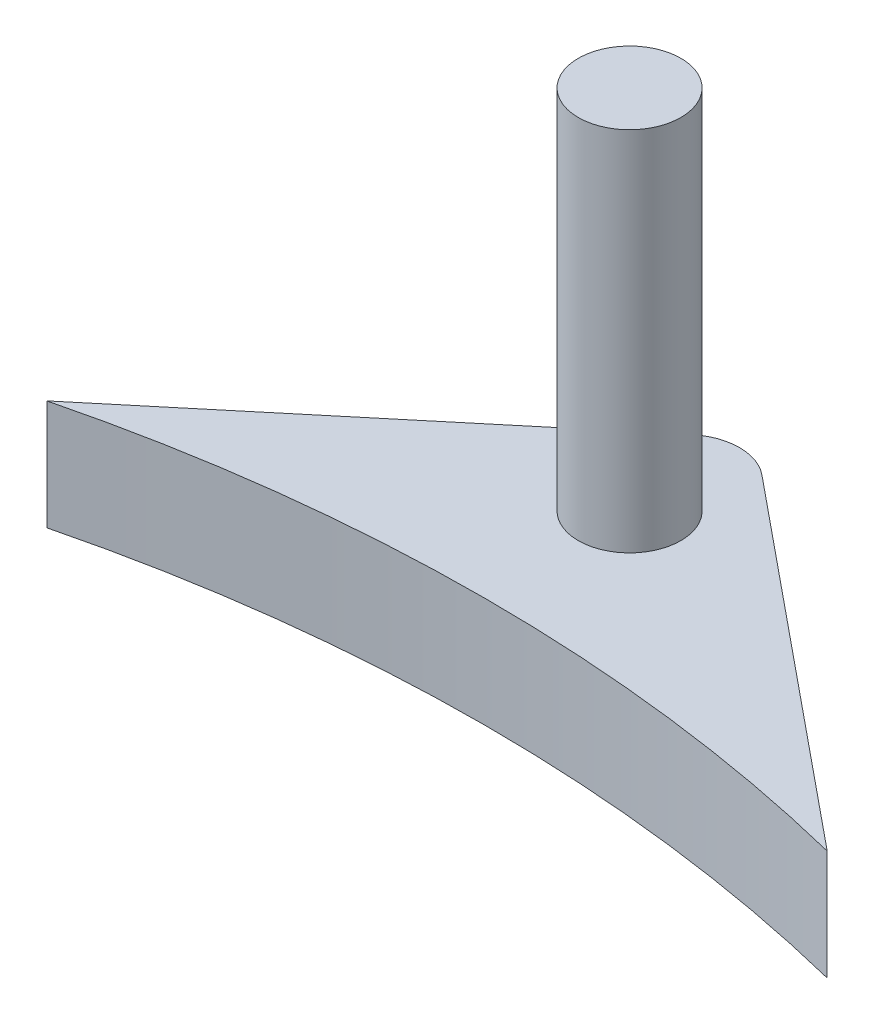
ISO-10303-21;
HEADER;
FILE_DESCRIPTION(('STEP AP214'),'2;1');
FILE_NAME('part.step','',(''),(''),'','','');
FILE_SCHEMA(('AUTOMOTIVE_DESIGN { 1 0 10303 214 1 1 1 1 }'));
ENDSEC;
DATA;
#1=APPLICATION_CONTEXT('core data for automotive mechanical design processes');
#2=APPLICATION_PROTOCOL_DEFINITION('international standard','automotive_design',2000,#1);
#3=PRODUCT_CONTEXT('',#1,'mechanical');
#4=PRODUCT('Part','Part','',(#3));
#5=PRODUCT_RELATED_PRODUCT_CATEGORY('part','',(#4));
#6=PRODUCT_DEFINITION_FORMATION('','',#4);
#7=PRODUCT_DEFINITION_CONTEXT('part definition',#1,'design');
#8=PRODUCT_DEFINITION('design','',#6,#7);
#9=PRODUCT_DEFINITION_SHAPE('','',#8);
#10=(LENGTH_UNIT() NAMED_UNIT(*) SI_UNIT(.MILLI.,.METRE.));
#11=(NAMED_UNIT(*) PLANE_ANGLE_UNIT() SI_UNIT($,.RADIAN.));
#12=(NAMED_UNIT(*) SI_UNIT($,.STERADIAN.) SOLID_ANGLE_UNIT());
#13=UNCERTAINTY_MEASURE_WITH_UNIT(LENGTH_MEASURE(1.E-05),#10,'distance_accuracy_value','');
#14=(GEOMETRIC_REPRESENTATION_CONTEXT(3) GLOBAL_UNCERTAINTY_ASSIGNED_CONTEXT((#13)) GLOBAL_UNIT_ASSIGNED_CONTEXT((#10,
#11,#12)) REPRESENTATION_CONTEXT('',''));
#15=CARTESIAN_POINT('',(0.,0.,0.));
#16=DIRECTION('',(0.,0.,1.));
#17=DIRECTION('',(1.,0.,0.));
#18=AXIS2_PLACEMENT_3D('',#15,#16,#17);
#19=CARTESIAN_POINT('',(0.,3.,0.));
#20=DIRECTION('',(0.,-1.,0.));
#21=DIRECTION('',(0.,0.,-1.));
#22=AXIS2_PLACEMENT_3D('',#19,#20,#21);
#23=CYLINDRICAL_SURFACE('',#22,1.5);
#24=CARTESIAN_POINT('',(0.,0.,0.));
#25=DIRECTION('',(0.,1.,0.));
#26=DIRECTION('',(0.,0.,1.));
#27=AXIS2_PLACEMENT_3D('',#24,#25,#26);
#28=CIRCLE('',#27,1.5);
#29=CARTESIAN_POINT('',(0.949630120317868,0.,-1.16112128332275));
#30=VERTEX_POINT('',#29);
#31=CARTESIAN_POINT('',(-0.960614143000478,0.,-1.15205054935426));
#32=VERTEX_POINT('',#31);
#33=EDGE_CURVE('E110',#30,#32,#28,.T.);
#34=ORIENTED_EDGE('',*,*,#33,.T.);
#35=DIRECTION('',(0.,-1.,0.));
#36=VECTOR('',#35,1.);
#37=CARTESIAN_POINT('',(-0.960614143000478,3.,-1.15205054935426));
#38=LINE('',#37,#36);
#39=CARTESIAN_POINT('',(-0.960614143000478,3.,-1.15205054935426));
#40=VERTEX_POINT('',#39);
#41=EDGE_CURVE('E42',#40,#32,#38,.T.);
#42=ORIENTED_EDGE('',*,*,#41,.F.);
#43=CARTESIAN_POINT('',(0.,3.,0.));
#44=DIRECTION('',(0.,1.,0.));
#45=DIRECTION('',(0.,0.,1.));
#46=AXIS2_PLACEMENT_3D('',#43,#44,#45);
#47=CIRCLE('',#46,1.5);
#48=CARTESIAN_POINT('',(0.949630120317868,3.,-1.16112128332275));
#49=VERTEX_POINT('',#48);
#50=EDGE_CURVE('E93',#49,#40,#47,.T.);
#51=ORIENTED_EDGE('',*,*,#50,.F.);
#52=DIRECTION('',(0.,-1.,0.));
#53=VECTOR('',#52,1.);
#54=CARTESIAN_POINT('',(0.949630120317868,3.,-1.16112128332275));
#55=LINE('',#54,#53);
#56=EDGE_CURVE('E106',#49,#30,#55,.T.);
#57=ORIENTED_EDGE('',*,*,#56,.T.);
#58=EDGE_LOOP('',(#34,#42,#51,#57));
#59=FACE_BOUND('',#58,.T.);
#60=ADVANCED_FACE('F39',(#59),#23,.T.);
#61=CARTESIAN_POINT('',(-0.960614143000478,3.,-1.15205054935426));
#62=DIRECTION('',(0.640409428666985,0.,0.768033699569508));
#63=DIRECTION('',(0.768033699569508,0.,-0.640409428666985));
#64=AXIS2_PLACEMENT_3D('',#61,#62,#63);
#65=PLANE('',#64);
#66=DIRECTION('',(-0.768033699569508,0.,0.640409428666985));
#67=VECTOR('',#66,1.);
#68=CARTESIAN_POINT('',(-0.960614143000478,0.,-1.15205054935426));
#69=LINE('',#68,#67);
#70=CARTESIAN_POINT('',(-10.5548976146623,0.,6.84794945064574));
#71=VERTEX_POINT('',#70);
#72=EDGE_CURVE('E99',#32,#71,#69,.T.);
#73=ORIENTED_EDGE('',*,*,#72,.T.);
#74=DIRECTION('',(0.,-1.,0.));
#75=VECTOR('',#74,1.);
#76=CARTESIAN_POINT('',(-10.5548976146623,3.,6.84794945064574));
#77=LINE('',#76,#75);
#78=CARTESIAN_POINT('',(-10.5548976146623,3.,6.84794945064574));
#79=VERTEX_POINT('',#78);
#80=EDGE_CURVE('E97',#79,#71,#77,.T.);
#81=ORIENTED_EDGE('',*,*,#80,.F.);
#82=DIRECTION('',(-0.768033699569508,0.,0.640409428666985));
#83=VECTOR('',#82,1.);
#84=CARTESIAN_POINT('',(-0.960614143000478,3.,-1.15205054935426));
#85=LINE('',#84,#83);
#86=EDGE_CURVE('E88',#40,#79,#85,.T.);
#87=ORIENTED_EDGE('',*,*,#86,.F.);
#88=ORIENTED_EDGE('',*,*,#41,.T.);
#89=EDGE_LOOP('',(#73,#81,#87,#88));
#90=FACE_BOUND('',#89,.T.);
#91=ADVANCED_FACE('F98',(#90),#65,.F.);
#92=CARTESIAN_POINT('',(0.106366283122832,3.,49.4688735058283));
#93=DIRECTION('',(0.,-1.,0.));
#94=DIRECTION('',(0.,0.,-1.));
#95=AXIS2_PLACEMENT_3D('',#92,#93,#94);
#96=CYLINDRICAL_SURFACE('',#95,43.9341065143683);
#97=CARTESIAN_POINT('',(0.106366283122832,0.,49.4688735058283));
#98=DIRECTION('',(0.,-1.,0.));
#99=DIRECTION('',(0.,0.,-1.));
#100=AXIS2_PLACEMENT_3D('',#97,#98,#99);
#101=CIRCLE('',#100,43.9341065143683);
#102=CARTESIAN_POINT('',(10.7313020237667,0.,6.83887871667725));
#103=VERTEX_POINT('',#102);
#104=EDGE_CURVE('E74',#71,#103,#101,.T.);
#105=ORIENTED_EDGE('',*,*,#104,.T.);
#106=DIRECTION('',(0.,-1.,0.));
#107=VECTOR('',#106,1.);
#108=CARTESIAN_POINT('',(10.7313020237667,3.,6.83887871667725));
#109=LINE('',#108,#107);
#110=CARTESIAN_POINT('',(10.7313020237667,3.,6.83887871667725));
#111=VERTEX_POINT('',#110);
#112=EDGE_CURVE('E101',#111,#103,#109,.T.);
#113=ORIENTED_EDGE('',*,*,#112,.F.);
#114=CARTESIAN_POINT('',(0.106366283122832,3.,49.4688735058283));
#115=DIRECTION('',(0.,-1.,0.));
#116=DIRECTION('',(0.,0.,-1.));
#117=AXIS2_PLACEMENT_3D('',#114,#115,#116);
#118=CIRCLE('',#117,43.9341065143683);
#119=EDGE_CURVE('E91',#79,#111,#118,.T.);
#120=ORIENTED_EDGE('',*,*,#119,.F.);
#121=ORIENTED_EDGE('',*,*,#80,.T.);
#122=EDGE_LOOP('',(#105,#113,#120,#121));
#123=FACE_BOUND('',#122,.T.);
#124=ADVANCED_FACE('F102',(#123),#96,.F.);
#125=CARTESIAN_POINT('',(0.949630120317868,3.,-1.16112128332275));
#126=DIRECTION('',(-0.633086746878578,0.,0.774080855548501));
#127=DIRECTION('',(0.774080855548501,0.,0.633086746878578));
#128=AXIS2_PLACEMENT_3D('',#125,#126,#127);
#129=PLANE('',#128);
#130=DIRECTION('',(-0.774080855548501,0.,-0.633086746878578));
#131=VECTOR('',#130,1.);
#132=CARTESIAN_POINT('',(0.949630120317868,0.,-1.16112128332275));
#133=LINE('',#132,#131);
#134=EDGE_CURVE('E80',#103,#30,#133,.T.);
#135=ORIENTED_EDGE('',*,*,#134,.T.);
#136=ORIENTED_EDGE('',*,*,#56,.F.);
#137=DIRECTION('',(-0.774080855548501,0.,-0.633086746878578));
#138=VECTOR('',#137,1.);
#139=CARTESIAN_POINT('',(0.949630120317868,3.,-1.16112128332275));
#140=LINE('',#139,#138);
#141=EDGE_CURVE('E57',#111,#49,#140,.T.);
#142=ORIENTED_EDGE('',*,*,#141,.F.);
#143=ORIENTED_EDGE('',*,*,#112,.T.);
#144=EDGE_LOOP('',(#135,#136,#142,#143));
#145=FACE_BOUND('',#144,.T.);
#146=ADVANCED_FACE('F124',(#145),#129,.F.);
#147=CARTESIAN_POINT('',(0.,3.,0.));
#148=DIRECTION('',(0.,1.,0.));
#149=DIRECTION('',(0.,0.,1.));
#150=AXIS2_PLACEMENT_3D('',#147,#148,#149);
#151=PLANE('',#150);
#152=CARTESIAN_POINT('',(0.,3.,1.5));
#153=DIRECTION('',(0.,1.,0.));
#154=DIRECTION('',(0.,0.,1.));
#155=AXIS2_PLACEMENT_3D('',#152,#153,#154);
#156=CIRCLE('',#155,1.4);
#157=CARTESIAN_POINT('',(0.,3.,2.9));
#158=VERTEX_POINT('',#157);
#159=EDGE_CURVE('E11',#158,#158,#156,.T.);
#160=ORIENTED_EDGE('',*,*,#159,.F.);
#161=EDGE_LOOP('',(#160));
#162=FACE_BOUND('',#161,.T.);
#163=ORIENTED_EDGE('',*,*,#50,.T.);
#164=ORIENTED_EDGE('',*,*,#86,.T.);
#165=ORIENTED_EDGE('',*,*,#119,.T.);
#166=ORIENTED_EDGE('',*,*,#141,.T.);
#167=EDGE_LOOP('',(#163,#164,#165,#166));
#168=FACE_BOUND('',#167,.T.);
#169=ADVANCED_FACE('F89',(#162,#168),#151,.T.);
#170=CARTESIAN_POINT('',(0.,0.,0.));
#171=DIRECTION('',(0.,1.,0.));
#172=DIRECTION('',(0.,0.,1.));
#173=AXIS2_PLACEMENT_3D('',#170,#171,#172);
#174=PLANE('',#173);
#175=ORIENTED_EDGE('',*,*,#33,.F.);
#176=ORIENTED_EDGE('',*,*,#134,.F.);
#177=ORIENTED_EDGE('',*,*,#104,.F.);
#178=ORIENTED_EDGE('',*,*,#72,.F.);
#179=EDGE_LOOP('',(#175,#176,#177,#178));
#180=FACE_BOUND('',#179,.T.);
#181=ADVANCED_FACE('F127',(#180),#174,.F.);
#182=CARTESIAN_POINT('',(0.,13.,1.5));
#183=DIRECTION('',(0.,-1.,0.));
#184=DIRECTION('',(0.,0.,-1.));
#185=AXIS2_PLACEMENT_3D('',#182,#183,#184);
#186=CYLINDRICAL_SURFACE('',#185,1.4);
#187=CARTESIAN_POINT('',(0.,13.,1.5));
#188=DIRECTION('',(0.,1.,0.));
#189=DIRECTION('',(0.,0.,1.));
#190=AXIS2_PLACEMENT_3D('',#187,#188,#189);
#191=CIRCLE('',#190,1.4);
#192=CARTESIAN_POINT('',(0.,13.,2.9));
#193=VERTEX_POINT('',#192);
#194=EDGE_CURVE('E114',#193,#193,#191,.T.);
#195=ORIENTED_EDGE('',*,*,#194,.F.);
#196=EDGE_LOOP('',(#195));
#197=FACE_BOUND('',#196,.T.);
#198=ORIENTED_EDGE('',*,*,#159,.T.);
#199=EDGE_LOOP('',(#198));
#200=FACE_BOUND('',#199,.T.);
#201=ADVANCED_FACE('F137',(#197,#200),#186,.T.);
#202=CARTESIAN_POINT('',(0.,13.,1.5));
#203=DIRECTION('',(0.,1.,0.));
#204=DIRECTION('',(0.,0.,1.));
#205=AXIS2_PLACEMENT_3D('',#202,#203,#204);
#206=PLANE('',#205);
#207=ORIENTED_EDGE('',*,*,#194,.T.);
#208=EDGE_LOOP('',(#207));
#209=FACE_BOUND('',#208,.T.);
#210=ADVANCED_FACE('F135',(#209),#206,.T.);
#211=CLOSED_SHELL('',(#60,#91,#124,#146,#169,#181,#201,#210));
#212=MANIFOLD_SOLID_BREP('B2',#211);
#213=ADVANCED_BREP_SHAPE_REPRESENTATION('',(#18,#212),#14);
#214=SHAPE_DEFINITION_REPRESENTATION(#9,#213);
ENDSEC;
END-ISO-10303-21;
